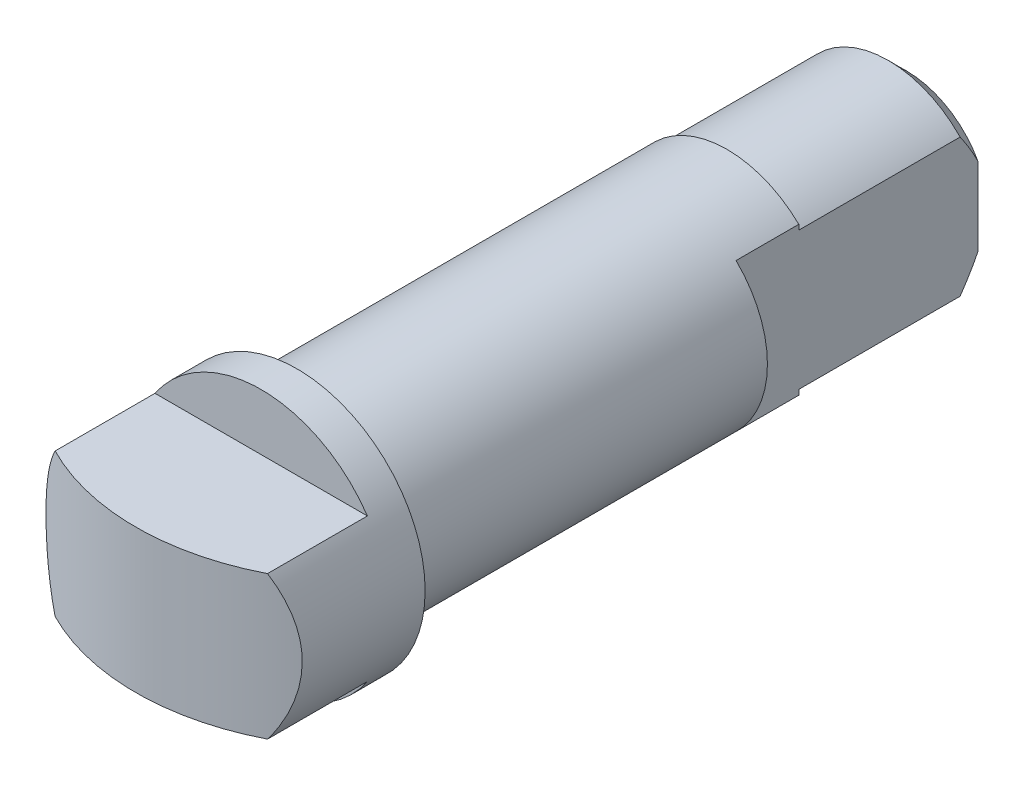
ISO-10303-21;
HEADER;
FILE_DESCRIPTION(('STEP AP214'),'2;1');
FILE_NAME('part.step','',(''),(''),'','','');
FILE_SCHEMA(('AUTOMOTIVE_DESIGN { 1 0 10303 214 1 1 1 1 }'));
ENDSEC;
DATA;
#1=APPLICATION_CONTEXT('core data for automotive mechanical design processes');
#2=APPLICATION_PROTOCOL_DEFINITION('international standard','automotive_design',2000,#1);
#3=PRODUCT_CONTEXT('',#1,'mechanical');
#4=PRODUCT('Part','Part','',(#3));
#5=PRODUCT_RELATED_PRODUCT_CATEGORY('part','',(#4));
#6=PRODUCT_DEFINITION_FORMATION('','',#4);
#7=PRODUCT_DEFINITION_CONTEXT('part definition',#1,'design');
#8=PRODUCT_DEFINITION('design','',#6,#7);
#9=PRODUCT_DEFINITION_SHAPE('','',#8);
#10=(LENGTH_UNIT() NAMED_UNIT(*) SI_UNIT(.MILLI.,.METRE.));
#11=(NAMED_UNIT(*) PLANE_ANGLE_UNIT() SI_UNIT($,.RADIAN.));
#12=(NAMED_UNIT(*) SI_UNIT($,.STERADIAN.) SOLID_ANGLE_UNIT());
#13=UNCERTAINTY_MEASURE_WITH_UNIT(LENGTH_MEASURE(1.E-05),#10,'distance_accuracy_value','');
#14=(GEOMETRIC_REPRESENTATION_CONTEXT(3) GLOBAL_UNCERTAINTY_ASSIGNED_CONTEXT((#13)) GLOBAL_UNIT_ASSIGNED_CONTEXT((#10,
#11,#12)) REPRESENTATION_CONTEXT('',''));
#15=CARTESIAN_POINT('',(0.,0.,0.));
#16=DIRECTION('',(0.,0.,1.));
#17=DIRECTION('',(1.,0.,0.));
#18=AXIS2_PLACEMENT_3D('',#15,#16,#17);
#19=CARTESIAN_POINT('',(0.,0.,2.));
#20=DIRECTION('',(0.,0.,1.));
#21=DIRECTION('',(1.,0.,0.));
#22=AXIS2_PLACEMENT_3D('',#19,#20,#21);
#23=PLANE('',#22);
#24=DIRECTION('',(1.,0.,0.));
#25=VECTOR('',#24,1.);
#26=CARTESIAN_POINT('',(-5.92642387954152,-4.,2.));
#27=LINE('',#26,#25);
#28=CARTESIAN_POINT('',(5.92642387954152,-4.,2.));
#29=VERTEX_POINT('',#28);
#30=CARTESIAN_POINT('',(-5.92642387954152,-4.,2.));
#31=VERTEX_POINT('',#30);
#32=EDGE_CURVE('E127',#29,#31,#27,.F.);
#33=ORIENTED_EDGE('',*,*,#32,.T.);
#34=CARTESIAN_POINT('',(0.,0.,2.));
#35=DIRECTION('',(0.,0.,1.));
#36=DIRECTION('',(1.,0.,0.));
#37=AXIS2_PLACEMENT_3D('',#34,#35,#36);
#38=CIRCLE('',#37,7.15);
#39=EDGE_CURVE('E142',#29,#31,#38,.F.);
#40=ORIENTED_EDGE('',*,*,#39,.F.);
#41=EDGE_LOOP('',(#33,#40));
#42=FACE_BOUND('',#41,.T.);
#43=ADVANCED_FACE('F18',(#42),#23,.T.);
#44=CARTESIAN_POINT('',(-5.92642387954152,-4.,9.));
#45=DIRECTION('',(0.,1.,0.));
#46=DIRECTION('',(0.,0.,1.));
#47=AXIS2_PLACEMENT_3D('',#44,#45,#46);
#48=PLANE('',#47);
#49=CARTESIAN_POINT('',(0.,-4.,-4.));
#50=DIRECTION('',(0.,-1.,0.));
#51=DIRECTION('',(1.,0.,0.));
#52=AXIS2_PLACEMENT_3D('',#49,#50,#51);
#53=CIRCLE('',#52,13.);
#54=CARTESIAN_POINT('',(-5.92642387954152,-4.,7.57054449885571));
#55=VERTEX_POINT('',#54);
#56=CARTESIAN_POINT('',(5.92642387954152,-4.,7.57054449885571));
#57=VERTEX_POINT('',#56);
#58=EDGE_CURVE('E21',#55,#57,#53,.F.);
#59=ORIENTED_EDGE('',*,*,#58,.F.);
#60=DIRECTION('',(0.,0.,1.));
#61=VECTOR('',#60,1.);
#62=CARTESIAN_POINT('',(-5.92642387954152,-4.,2.));
#63=LINE('',#62,#61);
#64=EDGE_CURVE('E120',#31,#55,#63,.T.);
#65=ORIENTED_EDGE('',*,*,#64,.F.);
#66=ORIENTED_EDGE('',*,*,#32,.F.);
#67=DIRECTION('',(0.,0.,1.));
#68=VECTOR('',#67,1.);
#69=CARTESIAN_POINT('',(5.92642387954152,-4.,2.));
#70=LINE('',#69,#68);
#71=EDGE_CURVE('E123',#57,#29,#70,.F.);
#72=ORIENTED_EDGE('',*,*,#71,.F.);
#73=EDGE_LOOP('',(#59,#65,#66,#72));
#74=FACE_BOUND('',#73,.T.);
#75=ADVANCED_FACE('F118',(#74),#48,.F.);
#76=CARTESIAN_POINT('',(0.,-7.150025,-4.));
#77=DIRECTION('',(0.,-1.,0.));
#78=DIRECTION('',(1.,0.,0.));
#79=AXIS2_PLACEMENT_3D('',#76,#77,#78);
#80=CYLINDRICAL_SURFACE('',#79,13.);
#81=ORIENTED_EDGE('',*,*,#58,.T.);
#82=CARTESIAN_POINT('',(5.92642387954152,4.,7.5705444988557));
#83=CARTESIAN_POINT('',(6.02826761777369,3.84910914606283,7.5183814585744));
#84=CARTESIAN_POINT('',(6.12455282690973,3.69402246735806,7.46736474262982));
#85=CARTESIAN_POINT('',(6.30546458594265,3.375961064015,7.36889298785948));
#86=CARTESIAN_POINT('',(6.39008275677941,3.21298078267545,7.32144051983297));
#87=CARTESIAN_POINT('',(6.54744381171085,2.87885042349019,7.23117366676062));
#88=CARTESIAN_POINT('',(6.62011213854141,2.70765706924609,7.18838892325316));
#89=CARTESIAN_POINT('',(6.7522657595311,2.35885152674343,7.10913357046209));
#90=CARTESIAN_POINT('',(6.81175298508131,2.18124028332255,7.07266203629257));
#91=CARTESIAN_POINT('',(6.91715186286272,1.81965618390198,7.00712899211632));
#92=CARTESIAN_POINT('',(6.96299207258808,1.63565529208902,6.97810658391696));
#93=CARTESIAN_POINT('',(7.0400531629363,1.26343493269416,6.92884948345827));
#94=CARTESIAN_POINT('',(7.07127343097694,1.0752152886908,6.90861515942624));
#95=CARTESIAN_POINT('',(7.11850768977287,0.696820913701711,6.87785109189797));
#96=CARTESIAN_POINT('',(7.13457960639309,0.50665646432597,6.86728438493025));
#97=CARTESIAN_POINT('',(7.15144656078072,0.125369130713346,6.85619269347045));
#98=CARTESIAN_POINT('',(7.152243284267,-0.0657536454373228,6.85566660093001));
#99=CARTESIAN_POINT('',(7.13921273877081,-0.428836660185208,6.86423874187427));
#100=CARTESIAN_POINT('',(7.12678511067466,-0.600871374204956,6.87241586145475));
#101=CARTESIAN_POINT('',(7.08961929954047,-0.943099367338352,6.89668714401131));
#102=CARTESIAN_POINT('',(7.06487666612975,-1.11329195801475,6.91278416904327));
#103=CARTESIAN_POINT('',(7.00331887607993,-1.4510548080192,6.95239074843211));
#104=CARTESIAN_POINT('',(6.96647314683044,-1.61861728874921,6.97591906850672));
#105=CARTESIAN_POINT('',(6.88116734128126,-1.94969505064608,7.02959962368301));
#106=CARTESIAN_POINT('',(6.83270232069214,-2.11320857611657,7.05975467816371));
#107=CARTESIAN_POINT('',(6.6748369075381,-2.58366949860598,7.156226468105));
#108=CARTESIAN_POINT('',(6.5503952455409,-2.88418668691921,7.23028975247378));
#109=CARTESIAN_POINT('',(6.33615682639975,-3.31684461145012,7.35164226832429));
#110=CARTESIAN_POINT('',(6.26036675517842,-3.45772172242448,7.39368746993782));
#111=CARTESIAN_POINT('',(6.09994470177552,-3.73343261915048,7.48037427437496));
#112=CARTESIAN_POINT('',(6.01531661223371,-3.86826902840262,7.52501473032939));
#113=CARTESIAN_POINT('',(5.92642387954152,-4.,7.57054449885571));
#114=B_SPLINE_CURVE_WITH_KNOTS('',3,(#82,#83,#84,#85,#86,#87,#88,#89,#90,#91,#92,#93,#94,#95,
#96,#97,#98,#99,#100,#101,#102,#103,#104,#105,#106,#107,#108,#109,#110,#111,#112,#113),
.UNSPECIFIED.,.F.,.F.,(4,2,2,2,2,2,2,2,2,2,2,2,2,2,2,4),(0.,0.568038351333795,1.13648255612546,
1.7083488585824,2.28013131152445,2.85485645138771,3.42960567034178,4.00214807803391,
4.57462730151,5.09202666368455,5.60961313853929,6.12851723045966,6.64764252175597,
7.64433512535002,8.14026186855841,8.63597109841601),.UNSPECIFIED.);
#115=CARTESIAN_POINT('',(5.92642387954152,4.,7.57054449885571));
#116=VERTEX_POINT('',#115);
#117=EDGE_CURVE('E149',#116,#57,#114,.T.);
#118=ORIENTED_EDGE('',*,*,#117,.F.);
#119=CARTESIAN_POINT('',(0.,4.,-4.));
#120=DIRECTION('',(0.,-1.,0.));
#121=DIRECTION('',(1.,0.,0.));
#122=AXIS2_PLACEMENT_3D('',#119,#120,#121);
#123=CIRCLE('',#122,13.);
#124=CARTESIAN_POINT('',(-5.92642387954152,4.,7.57054449885571));
#125=VERTEX_POINT('',#124);
#126=EDGE_CURVE('E132',#116,#125,#123,.T.);
#127=ORIENTED_EDGE('',*,*,#126,.T.);
#128=CARTESIAN_POINT('',(-5.92642387954152,-4.,7.57054449885571));
#129=CARTESIAN_POINT('',(-6.02826761777369,-3.84910914606283,7.51838145857441));
#130=CARTESIAN_POINT('',(-6.12455282690973,-3.69402246735806,7.46736474262982));
#131=CARTESIAN_POINT('',(-6.30546458594265,-3.375961064015,7.36889298785949));
#132=CARTESIAN_POINT('',(-6.39008275677941,-3.21298078267545,7.32144051983297));
#133=CARTESIAN_POINT('',(-6.54744381171085,-2.87885042349019,7.23117366676062));
#134=CARTESIAN_POINT('',(-6.62011213854141,-2.70765706924609,7.18838892325317));
#135=CARTESIAN_POINT('',(-6.7522657595311,-2.35885152674343,7.10913357046209));
#136=CARTESIAN_POINT('',(-6.81175298508131,-2.18124028332255,7.07266203629257));
#137=CARTESIAN_POINT('',(-6.91715186286272,-1.81965618390198,7.00712899211632));
#138=CARTESIAN_POINT('',(-6.96299207258808,-1.63565529208902,6.97810658391696));
#139=CARTESIAN_POINT('',(-7.0400531629363,-1.26343493269416,6.92884948345827));
#140=CARTESIAN_POINT('',(-7.07127343097694,-1.07521528869081,6.90861515942625));
#141=CARTESIAN_POINT('',(-7.11850768977287,-0.696820913701711,6.87785109189797));
#142=CARTESIAN_POINT('',(-7.13457960639309,-0.50665646432597,6.86728438493025));
#143=CARTESIAN_POINT('',(-7.15144656078072,-0.125369130713347,6.85619269347045));
#144=CARTESIAN_POINT('',(-7.152243284267,0.0657536454373224,6.85566660093001));
#145=CARTESIAN_POINT('',(-7.13921273877081,0.428836660185208,6.86423874187427));
#146=CARTESIAN_POINT('',(-7.12678511067466,0.600871374204956,6.87241586145475));
#147=CARTESIAN_POINT('',(-7.08961929954047,0.943099367338351,6.89668714401132));
#148=CARTESIAN_POINT('',(-7.06487666612975,1.11329195801475,6.91278416904327));
#149=CARTESIAN_POINT('',(-7.00331887607993,1.4510548080192,6.95239074843212));
#150=CARTESIAN_POINT('',(-6.96647314683044,1.61861728874921,6.97591906850672));
#151=CARTESIAN_POINT('',(-6.88116734128126,1.94969505064608,7.02959962368301));
#152=CARTESIAN_POINT('',(-6.83270232069214,2.11320857611657,7.05975467816371));
#153=CARTESIAN_POINT('',(-6.6748369075381,2.58366949860598,7.156226468105));
#154=CARTESIAN_POINT('',(-6.5503952455409,2.88418668691921,7.23028975247378));
#155=CARTESIAN_POINT('',(-6.33615682639975,3.31684461145012,7.35164226832429));
#156=CARTESIAN_POINT('',(-6.26036675517842,3.45772172242448,7.39368746993782));
#157=CARTESIAN_POINT('',(-6.09994470177552,3.73343261915048,7.48037427437496));
#158=CARTESIAN_POINT('',(-6.01531661223371,3.86826902840262,7.52501473032939));
#159=CARTESIAN_POINT('',(-5.92642387954152,4.,7.57054449885571));
#160=B_SPLINE_CURVE_WITH_KNOTS('',3,(#128,#129,#130,#131,#132,#133,#134,#135,#136,#137,#138,
#139,#140,#141,#142,#143,#144,#145,#146,#147,#148,#149,#150,#151,#152,#153,#154,#155,#156,#157,
#158,#159),.UNSPECIFIED.,.F.,.F.,(4,2,2,2,2,2,2,2,2,2,2,2,2,2,2,4),(0.,0.568038351333795,
1.13648255612546,1.7083488585824,2.28013131152445,2.85485645138771,3.42960567034178,
4.00214807803391,4.57462730151,5.09202666368455,5.60961313853929,6.12851723045966,
6.64764252175597,7.64433512535002,8.1402618685584,8.63597109841601),.UNSPECIFIED.);
#161=EDGE_CURVE('E129',#55,#125,#160,.T.);
#162=ORIENTED_EDGE('',*,*,#161,.F.);
#163=EDGE_LOOP('',(#81,#118,#127,#162));
#164=FACE_BOUND('',#163,.T.);
#165=ADVANCED_FACE('F130',(#164),#80,.T.);
#166=CARTESIAN_POINT('',(0.,0.,2.));
#167=DIRECTION('',(0.,0.,1.));
#168=DIRECTION('',(1.,0.,0.));
#169=AXIS2_PLACEMENT_3D('',#166,#167,#168);
#170=PLANE('',#169);
#171=DIRECTION('',(1.,0.,0.));
#172=VECTOR('',#171,1.);
#173=CARTESIAN_POINT('',(-5.92642387954152,4.,2.));
#174=LINE('',#173,#172);
#175=CARTESIAN_POINT('',(-5.92642387954152,4.,2.));
#176=VERTEX_POINT('',#175);
#177=CARTESIAN_POINT('',(5.92642387954152,4.,2.));
#178=VERTEX_POINT('',#177);
#179=EDGE_CURVE('E126',#176,#178,#174,.T.);
#180=ORIENTED_EDGE('',*,*,#179,.T.);
#181=CARTESIAN_POINT('',(0.,0.,2.));
#182=DIRECTION('',(0.,0.,1.));
#183=DIRECTION('',(1.,0.,0.));
#184=AXIS2_PLACEMENT_3D('',#181,#182,#183);
#185=CIRCLE('',#184,7.15);
#186=EDGE_CURVE('E292',#176,#178,#185,.F.);
#187=ORIENTED_EDGE('',*,*,#186,.F.);
#188=EDGE_LOOP('',(#180,#187));
#189=FACE_BOUND('',#188,.T.);
#190=ADVANCED_FACE('F310',(#189),#170,.T.);
#191=CARTESIAN_POINT('',(-5.92642387954152,4.,9.));
#192=DIRECTION('',(0.,-1.,0.));
#193=DIRECTION('',(1.,0.,0.));
#194=AXIS2_PLACEMENT_3D('',#191,#192,#193);
#195=PLANE('',#194);
#196=ORIENTED_EDGE('',*,*,#126,.F.);
#197=DIRECTION('',(0.,0.,1.));
#198=VECTOR('',#197,1.);
#199=CARTESIAN_POINT('',(5.92642387954152,4.,2.));
#200=LINE('',#199,#198);
#201=EDGE_CURVE('E290',#178,#116,#200,.T.);
#202=ORIENTED_EDGE('',*,*,#201,.F.);
#203=ORIENTED_EDGE('',*,*,#179,.F.);
#204=DIRECTION('',(0.,0.,1.));
#205=VECTOR('',#204,1.);
#206=CARTESIAN_POINT('',(-5.92642387954152,4.,2.));
#207=LINE('',#206,#205);
#208=EDGE_CURVE('E136',#125,#176,#207,.F.);
#209=ORIENTED_EDGE('',*,*,#208,.F.);
#210=EDGE_LOOP('',(#196,#202,#203,#209));
#211=FACE_BOUND('',#210,.T.);
#212=ADVANCED_FACE('F316',(#211),#195,.F.);
#213=CARTESIAN_POINT('',(0.,0.,2.));
#214=DIRECTION('',(0.,0.,1.));
#215=DIRECTION('',(1.,0.,0.));
#216=AXIS2_PLACEMENT_3D('',#213,#214,#215);
#217=CYLINDRICAL_SURFACE('',#216,7.15);
#218=ORIENTED_EDGE('',*,*,#186,.T.);
#219=ORIENTED_EDGE('',*,*,#201,.T.);
#220=ORIENTED_EDGE('',*,*,#117,.T.);
#221=ORIENTED_EDGE('',*,*,#71,.T.);
#222=ORIENTED_EDGE('',*,*,#39,.T.);
#223=ORIENTED_EDGE('',*,*,#64,.T.);
#224=ORIENTED_EDGE('',*,*,#161,.T.);
#225=ORIENTED_EDGE('',*,*,#208,.T.);
#226=EDGE_LOOP('',(#218,#219,#220,#221,#222,#223,#224,#225));
#227=FACE_BOUND('',#226,.T.);
#228=CARTESIAN_POINT('',(0.,0.,0.));
#229=DIRECTION('',(0.,0.,1.));
#230=DIRECTION('',(1.,0.,0.));
#231=AXIS2_PLACEMENT_3D('',#228,#229,#230);
#232=CIRCLE('',#231,7.15);
#233=CARTESIAN_POINT('',(7.15,0.,0.));
#234=VERTEX_POINT('',#233);
#235=EDGE_CURVE('E285',#234,#234,#232,.T.);
#236=ORIENTED_EDGE('',*,*,#235,.T.);
#237=EDGE_LOOP('',(#236));
#238=FACE_BOUND('',#237,.T.);
#239=ADVANCED_FACE('F139',(#227,#238),#217,.T.);
#240=CARTESIAN_POINT('',(0.,0.,-38.6095659183702));
#241=DIRECTION('',(0.,0.,1.));
#242=DIRECTION('',(1.,0.,0.));
#243=AXIS2_PLACEMENT_3D('',#240,#241,#242);
#244=CYLINDRICAL_SURFACE('',#243,5.55);
#245=DIRECTION('',(0.,0.,1.));
#246=VECTOR('',#245,1.);
#247=CARTESIAN_POINT('',(4.,-3.84740172064213,-20.5));
#248=LINE('',#247,#246);
#249=CARTESIAN_POINT('',(4.,-3.84740172064987,-32.9999999999528));
#250=VERTEX_POINT('',#249);
#251=CARTESIAN_POINT('',(4.,-3.84740172064213,-24.));
#252=VERTEX_POINT('',#251);
#253=EDGE_CURVE('E269',#250,#252,#248,.T.);
#254=ORIENTED_EDGE('',*,*,#253,.T.);
#255=CARTESIAN_POINT('',(0.,0.,-24.));
#256=DIRECTION('',(0.,0.,1.));
#257=DIRECTION('',(1.,0.,0.));
#258=AXIS2_PLACEMENT_3D('',#255,#256,#257);
#259=CIRCLE('',#258,5.55);
#260=CARTESIAN_POINT('',(-4.,-3.84740172064212,-24.));
#261=VERTEX_POINT('',#260);
#262=EDGE_CURVE('E339',#261,#252,#259,.T.);
#263=ORIENTED_EDGE('',*,*,#262,.F.);
#264=DIRECTION('',(0.,0.,1.));
#265=VECTOR('',#264,1.);
#266=CARTESIAN_POINT('',(-4.,-3.84740172064212,-20.5));
#267=LINE('',#266,#265);
#268=CARTESIAN_POINT('',(-4.,-3.84740172066226,-32.9999999999442));
#269=VERTEX_POINT('',#268);
#270=EDGE_CURVE('E261',#261,#269,#267,.F.);
#271=ORIENTED_EDGE('',*,*,#270,.T.);
#272=CARTESIAN_POINT('',(0.,0.,-32.9999999999586));
#273=DIRECTION('',(0.,0.,1.));
#274=DIRECTION('',(1.,0.,0.));
#275=AXIS2_PLACEMENT_3D('',#272,#273,#274);
#276=CIRCLE('',#275,5.55000000002792);
#277=EDGE_CURVE('E287',#250,#269,#276,.F.);
#278=ORIENTED_EDGE('',*,*,#277,.F.);
#279=EDGE_LOOP('',(#254,#263,#271,#278));
#280=FACE_BOUND('',#279,.T.);
#281=ADVANCED_FACE('F325',(#280),#244,.T.);
#282=CARTESIAN_POINT('',(0.,0.,-33.0000000000155));
#283=DIRECTION('',(0.,0.,1.));
#284=DIRECTION('',(1.,0.,0.));
#285=AXIS2_PLACEMENT_3D('',#282,#283,#284);
#286=CONICAL_SURFACE('',#285,5.54999999991423,0.785398163397448);
#287=CARTESIAN_POINT('',(-4.,-3.84740172061732,-32.9999999999469));
#288=CARTESIAN_POINT('',(-4.,-3.71334624797155,-33.0928721347658));
#289=CARTESIAN_POINT('',(-4.,-3.57813526733865,-33.1841357244921));
#290=CARTESIAN_POINT('',(-4.,-3.30513111755587,-33.3622224096445));
#291=CARTESIAN_POINT('',(-4.,-3.16734235631569,-33.4490522801269));
#292=CARTESIAN_POINT('',(-4.,-2.88842399877376,-33.6173887213157));
#293=CARTESIAN_POINT('',(-4.,-2.74729281132558,-33.6988926843124));
#294=CARTESIAN_POINT('',(-4.,-2.53264670941345,-33.8160057737275));
#295=CARTESIAN_POINT('',(-4.,-2.4605479938757,-33.8542146368809));
#296=CARTESIAN_POINT('',(-4.,-2.31532196283319,-33.9286541604015));
#297=CARTESIAN_POINT('',(-4.,-2.24219447123362,-33.9648844767912));
#298=CARTESIAN_POINT('',(-4.,-2.16852484419748,-33.9999999999405));
#299=B_SPLINE_CURVE_WITH_KNOTS('',3,(#287,#288,#289,#290,#291,#292,#293,#294,#295,#296,#297,
#298),.UNSPECIFIED.,.F.,.F.,(4,2,2,2,2,4),(0.,0.489285920590118,0.977800312369852,
1.46655212911046,1.71131730395998,1.9561248975318),.UNSPECIFIED.);
#300=CARTESIAN_POINT('',(-4.,-2.16852484420328,-33.9999999999377));
#301=VERTEX_POINT('',#300);
#302=EDGE_CURVE('E178',#269,#301,#299,.T.);
#303=ORIENTED_EDGE('',*,*,#302,.T.);
#304=CARTESIAN_POINT('',(0.,0.,-33.999999999935));
#305=DIRECTION('',(0.,0.,1.));
#306=DIRECTION('',(1.,0.,0.));
#307=AXIS2_PLACEMENT_3D('',#304,#305,#306);
#308=CIRCLE('',#307,4.54999999999472);
#309=CARTESIAN_POINT('',(4.,-2.16852484414086,-33.9999999999675));
#310=VERTEX_POINT('',#309);
#311=EDGE_CURVE('E289',#310,#301,#308,.F.);
#312=ORIENTED_EDGE('',*,*,#311,.F.);
#313=CARTESIAN_POINT('',(4.,-2.16852484419749,-33.9999999999405));
#314=CARTESIAN_POINT('',(4.,-2.24219447123362,-33.9648844767912));
#315=CARTESIAN_POINT('',(4.,-2.31532196283319,-33.9286541604015));
#316=CARTESIAN_POINT('',(4.,-2.4605479938757,-33.8542146368809));
#317=CARTESIAN_POINT('',(4.,-2.53264670941345,-33.8160057737275));
#318=CARTESIAN_POINT('',(4.,-2.74729281132559,-33.6988926843124));
#319=CARTESIAN_POINT('',(4.,-2.88842399877376,-33.6173887213156));
#320=CARTESIAN_POINT('',(4.,-3.1673423563157,-33.4490522801269));
#321=CARTESIAN_POINT('',(4.,-3.30513111755588,-33.3622224096445));
#322=CARTESIAN_POINT('',(4.,-3.57813526733865,-33.1841357244921));
#323=CARTESIAN_POINT('',(4.,-3.71334624797156,-33.0928721347658));
#324=CARTESIAN_POINT('',(4.,-3.84740172061732,-32.9999999999469));
#325=B_SPLINE_CURVE_WITH_KNOTS('',3,(#313,#314,#315,#316,#317,#318,#319,#320,#321,#322,#323,
#324),.UNSPECIFIED.,.F.,.F.,(4,2,2,2,2,4),(0.,0.244807593571818,0.489572768421334,
0.978324585161955,1.46683897694169,1.9561248975318),.UNSPECIFIED.);
#326=EDGE_CURVE('E209',#310,#250,#325,.T.);
#327=ORIENTED_EDGE('',*,*,#326,.T.);
#328=ORIENTED_EDGE('',*,*,#277,.T.);
#329=EDGE_LOOP('',(#303,#312,#327,#328));
#330=FACE_BOUND('',#329,.T.);
#331=ADVANCED_FACE('F329',(#330),#286,.T.);
#332=CARTESIAN_POINT('',(0.,0.,-34.));
#333=DIRECTION('',(0.,0.,-1.));
#334=DIRECTION('',(-1.,0.,0.));
#335=AXIS2_PLACEMENT_3D('',#332,#333,#334);
#336=PLANE('',#335);
#337=DIRECTION('',(0.,-1.,0.));
#338=VECTOR('',#337,1.);
#339=CARTESIAN_POINT('',(4.,9.6,-34.));
#340=LINE('',#339,#338);
#341=CARTESIAN_POINT('',(4.,2.16852484420328,-33.9999999999377));
#342=VERTEX_POINT('',#341);
#343=EDGE_CURVE('E206',#342,#310,#340,.T.);
#344=ORIENTED_EDGE('',*,*,#343,.T.);
#345=ORIENTED_EDGE('',*,*,#311,.T.);
#346=DIRECTION('',(0.,1.,0.));
#347=VECTOR('',#346,1.);
#348=CARTESIAN_POINT('',(-4.,9.6,-34.));
#349=LINE('',#348,#347);
#350=CARTESIAN_POINT('',(-4.,2.16852484414085,-33.9999999999675));
#351=VERTEX_POINT('',#350);
#352=EDGE_CURVE('E177',#301,#351,#349,.T.);
#353=ORIENTED_EDGE('',*,*,#352,.T.);
#354=CARTESIAN_POINT('',(0.,0.,-33.999999999935));
#355=DIRECTION('',(0.,0.,1.));
#356=DIRECTION('',(1.,0.,0.));
#357=AXIS2_PLACEMENT_3D('',#354,#355,#356);
#358=CIRCLE('',#357,4.54999999999472);
#359=EDGE_CURVE('E286',#342,#351,#358,.T.);
#360=ORIENTED_EDGE('',*,*,#359,.F.);
#361=EDGE_LOOP('',(#344,#345,#353,#360));
#362=FACE_BOUND('',#361,.T.);
#363=ADVANCED_FACE('F194',(#362),#336,.T.);
#364=CARTESIAN_POINT('',(0.,0.,-33.0000000000155));
#365=DIRECTION('',(0.,0.,1.));
#366=DIRECTION('',(1.,0.,0.));
#367=AXIS2_PLACEMENT_3D('',#364,#365,#366);
#368=CONICAL_SURFACE('',#367,5.54999999991423,0.785398163397448);
#369=CARTESIAN_POINT('',(4.,3.84740172060921,-32.9999999999525));
#370=CARTESIAN_POINT('',(4.,3.71334624796408,-33.0928721347709));
#371=CARTESIAN_POINT('',(4.,3.57813526733181,-33.1841357244966));
#372=CARTESIAN_POINT('',(4.,3.30513111755032,-33.3622224096481));
#373=CARTESIAN_POINT('',(4.,3.1673423563108,-33.4490522801299));
#374=CARTESIAN_POINT('',(4.,2.8884239987702,-33.6173887213177));
#375=CARTESIAN_POINT('',(4.,2.74729281132271,-33.698892684314));
#376=CARTESIAN_POINT('',(4.,2.53264670941163,-33.8160057737285));
#377=CARTESIAN_POINT('',(4.,2.46054799387424,-33.8542146368817));
#378=CARTESIAN_POINT('',(4.,2.31532196283245,-33.9286541604019));
#379=CARTESIAN_POINT('',(4.,2.24219447123325,-33.9648844767914));
#380=CARTESIAN_POINT('',(4.,2.16852484419749,-33.9999999999405));
#381=B_SPLINE_CURVE_WITH_KNOTS('',3,(#369,#370,#371,#372,#373,#374,#375,#376,#377,#378,#379,
#380),.UNSPECIFIED.,.F.,.F.,(4,2,2,2,2,4),(0.,0.489285920587646,0.977800312364913,
1.46655212910307,1.71131730395135,1.95612489752193),.UNSPECIFIED.);
#382=CARTESIAN_POINT('',(4.,3.84740172064213,-32.9999999999648));
#383=VERTEX_POINT('',#382);
#384=EDGE_CURVE('E199',#383,#342,#381,.T.);
#385=ORIENTED_EDGE('',*,*,#384,.T.);
#386=ORIENTED_EDGE('',*,*,#359,.T.);
#387=CARTESIAN_POINT('',(-4.,2.16852484419749,-33.9999999999405));
#388=CARTESIAN_POINT('',(-4.,2.24219447123325,-33.9648844767914));
#389=CARTESIAN_POINT('',(-4.,2.31532196283245,-33.9286541604019));
#390=CARTESIAN_POINT('',(-4.,2.46054799387424,-33.8542146368817));
#391=CARTESIAN_POINT('',(-4.,2.53264670941163,-33.8160057737285));
#392=CARTESIAN_POINT('',(-4.,2.74729281132271,-33.698892684314));
#393=CARTESIAN_POINT('',(-4.,2.8884239987702,-33.6173887213177));
#394=CARTESIAN_POINT('',(-4.,3.1673423563108,-33.4490522801299));
#395=CARTESIAN_POINT('',(-4.,3.30513111755032,-33.3622224096481));
#396=CARTESIAN_POINT('',(-4.,3.5781352673318,-33.1841357244966));
#397=CARTESIAN_POINT('',(-4.,3.71334624796407,-33.0928721347709));
#398=CARTESIAN_POINT('',(-4.,3.84740172060921,-32.9999999999525));
#399=B_SPLINE_CURVE_WITH_KNOTS('',3,(#387,#388,#389,#390,#391,#392,#393,#394,#395,#396,#397,
#398),.UNSPECIFIED.,.F.,.F.,(4,2,2,2,2,4),(0.,0.244807593570581,0.489572768418863,
0.978324585157017,1.46683897693428,1.95612489752193),.UNSPECIFIED.);
#400=CARTESIAN_POINT('',(-4.,3.84740172062567,-32.9999999999763));
#401=VERTEX_POINT('',#400);
#402=EDGE_CURVE('E170',#351,#401,#399,.T.);
#403=ORIENTED_EDGE('',*,*,#402,.T.);
#404=CARTESIAN_POINT('',(0.,0.,-33.));
#405=DIRECTION('',(0.,0.,1.));
#406=DIRECTION('',(1.,0.,0.));
#407=AXIS2_PLACEMENT_3D('',#404,#405,#406);
#408=CIRCLE('',#407,5.55);
#409=EDGE_CURVE('E282',#383,#401,#408,.T.);
#410=ORIENTED_EDGE('',*,*,#409,.F.);
#411=EDGE_LOOP('',(#385,#386,#403,#410));
#412=FACE_BOUND('',#411,.T.);
#413=ADVANCED_FACE('F188',(#412),#368,.T.);
#414=CARTESIAN_POINT('',(0.,0.,-38.6095659183702));
#415=DIRECTION('',(0.,0.,1.));
#416=DIRECTION('',(1.,0.,0.));
#417=AXIS2_PLACEMENT_3D('',#414,#415,#416);
#418=CYLINDRICAL_SURFACE('',#417,5.55);
#419=DIRECTION('',(0.,0.,1.));
#420=VECTOR('',#419,1.);
#421=CARTESIAN_POINT('',(-4.,3.84740172064213,-20.5));
#422=LINE('',#421,#420);
#423=CARTESIAN_POINT('',(-4.,3.84740172064213,-24.));
#424=VERTEX_POINT('',#423);
#425=EDGE_CURVE('E169',#401,#424,#422,.T.);
#426=ORIENTED_EDGE('',*,*,#425,.T.);
#427=CARTESIAN_POINT('',(0.,0.,-24.));
#428=DIRECTION('',(0.,0.,1.));
#429=DIRECTION('',(1.,0.,0.));
#430=AXIS2_PLACEMENT_3D('',#427,#428,#429);
#431=CIRCLE('',#430,5.55);
#432=CARTESIAN_POINT('',(4.,3.84740172064213,-24.));
#433=VERTEX_POINT('',#432);
#434=EDGE_CURVE('E208',#433,#424,#431,.T.);
#435=ORIENTED_EDGE('',*,*,#434,.F.);
#436=DIRECTION('',(0.,0.,1.));
#437=VECTOR('',#436,1.);
#438=CARTESIAN_POINT('',(4.,3.84740172064213,-20.5));
#439=LINE('',#438,#437);
#440=EDGE_CURVE('E207',#433,#383,#439,.F.);
#441=ORIENTED_EDGE('',*,*,#440,.T.);
#442=ORIENTED_EDGE('',*,*,#409,.T.);
#443=EDGE_LOOP('',(#426,#435,#441,#442));
#444=FACE_BOUND('',#443,.T.);
#445=ADVANCED_FACE('F193',(#444),#418,.T.);
#446=CARTESIAN_POINT('',(0.,0.,0.));
#447=DIRECTION('',(0.,0.,1.));
#448=DIRECTION('',(1.,0.,0.));
#449=AXIS2_PLACEMENT_3D('',#446,#447,#448);
#450=PLANE('',#449);
#451=CARTESIAN_POINT('',(0.,0.,0.));
#452=DIRECTION('',(0.,0.,-1.));
#453=DIRECTION('',(-1.,0.,0.));
#454=AXIS2_PLACEMENT_3D('',#451,#452,#453);
#455=CIRCLE('',#454,5.75);
#456=CARTESIAN_POINT('',(-5.75,0.,0.));
#457=VERTEX_POINT('',#456);
#458=EDGE_CURVE('E166',#457,#457,#455,.T.);
#459=ORIENTED_EDGE('',*,*,#458,.F.);
#460=EDGE_LOOP('',(#459));
#461=FACE_BOUND('',#460,.T.);
#462=ORIENTED_EDGE('',*,*,#235,.F.);
#463=EDGE_LOOP('',(#462));
#464=FACE_BOUND('',#463,.T.);
#465=ADVANCED_FACE('F231',(#461,#464),#450,.F.);
#466=CARTESIAN_POINT('',(-4.,-7.4,-20.5));
#467=DIRECTION('',(0.,0.,-1.));
#468=DIRECTION('',(-1.,0.,0.));
#469=AXIS2_PLACEMENT_3D('',#466,#467,#468);
#470=PLANE('',#469);
#471=DIRECTION('',(0.,1.,0.));
#472=VECTOR('',#471,1.);
#473=CARTESIAN_POINT('',(-4.,9.6,-20.5));
#474=LINE('',#473,#472);
#475=CARTESIAN_POINT('',(-4.,4.13067791046458,-20.5));
#476=VERTEX_POINT('',#475);
#477=CARTESIAN_POINT('',(-4.,-4.13067791046458,-20.5));
#478=VERTEX_POINT('',#477);
#479=EDGE_CURVE('E264',#476,#478,#474,.F.);
#480=ORIENTED_EDGE('',*,*,#479,.T.);
#481=CARTESIAN_POINT('',(0.,0.,-20.5));
#482=DIRECTION('',(0.,0.,-1.));
#483=DIRECTION('',(-1.,0.,0.));
#484=AXIS2_PLACEMENT_3D('',#481,#482,#483);
#485=CIRCLE('',#484,5.75);
#486=EDGE_CURVE('E163',#476,#478,#485,.F.);
#487=ORIENTED_EDGE('',*,*,#486,.F.);
#488=EDGE_LOOP('',(#480,#487));
#489=FACE_BOUND('',#488,.T.);
#490=ADVANCED_FACE('F228',(#489),#470,.T.);
#491=CARTESIAN_POINT('',(0.,0.,-24.));
#492=DIRECTION('',(0.,0.,-1.));
#493=DIRECTION('',(-1.,0.,0.));
#494=AXIS2_PLACEMENT_3D('',#491,#492,#493);
#495=PLANE('',#494);
#496=DIRECTION('',(0.,1.,0.));
#497=VECTOR('',#496,1.);
#498=CARTESIAN_POINT('',(-4.,9.6,-24.));
#499=LINE('',#498,#497);
#500=CARTESIAN_POINT('',(-4.,-4.13067791046458,-24.));
#501=VERTEX_POINT('',#500);
#502=EDGE_CURVE('E278',#501,#261,#499,.T.);
#503=ORIENTED_EDGE('',*,*,#502,.T.);
#504=ORIENTED_EDGE('',*,*,#262,.T.);
#505=DIRECTION('',(0.,-1.,0.));
#506=VECTOR('',#505,1.);
#507=CARTESIAN_POINT('',(4.,9.6,-24.));
#508=LINE('',#507,#506);
#509=CARTESIAN_POINT('',(4.,-4.13067791046458,-24.));
#510=VERTEX_POINT('',#509);
#511=EDGE_CURVE('E271',#252,#510,#508,.T.);
#512=ORIENTED_EDGE('',*,*,#511,.T.);
#513=CARTESIAN_POINT('',(0.,0.,-24.));
#514=DIRECTION('',(0.,0.,-1.));
#515=DIRECTION('',(-1.,0.,0.));
#516=AXIS2_PLACEMENT_3D('',#513,#514,#515);
#517=CIRCLE('',#516,5.75);
#518=EDGE_CURVE('E159',#501,#510,#517,.F.);
#519=ORIENTED_EDGE('',*,*,#518,.F.);
#520=EDGE_LOOP('',(#503,#504,#512,#519));
#521=FACE_BOUND('',#520,.T.);
#522=ADVANCED_FACE('F224',(#521),#495,.T.);
#523=CARTESIAN_POINT('',(14.4,-7.4,-20.5));
#524=DIRECTION('',(0.,0.,-1.));
#525=DIRECTION('',(-1.,0.,0.));
#526=AXIS2_PLACEMENT_3D('',#523,#524,#525);
#527=PLANE('',#526);
#528=CARTESIAN_POINT('',(0.,0.,-20.5));
#529=DIRECTION('',(0.,0.,-1.));
#530=DIRECTION('',(-1.,0.,0.));
#531=AXIS2_PLACEMENT_3D('',#528,#529,#530);
#532=CIRCLE('',#531,5.75);
#533=CARTESIAN_POINT('',(4.,-4.13067791046458,-20.5));
#534=VERTEX_POINT('',#533);
#535=CARTESIAN_POINT('',(4.,4.13067791046458,-20.5));
#536=VERTEX_POINT('',#535);
#537=EDGE_CURVE('E155',#534,#536,#532,.F.);
#538=ORIENTED_EDGE('',*,*,#537,.F.);
#539=DIRECTION('',(0.,-1.,0.));
#540=VECTOR('',#539,1.);
#541=CARTESIAN_POINT('',(4.,9.6,-20.5));
#542=LINE('',#541,#540);
#543=EDGE_CURVE('E268',#534,#536,#542,.F.);
#544=ORIENTED_EDGE('',*,*,#543,.T.);
#545=EDGE_LOOP('',(#538,#544));
#546=FACE_BOUND('',#545,.T.);
#547=ADVANCED_FACE('F219',(#546),#527,.T.);
#548=CARTESIAN_POINT('',(4.,9.6,-20.5));
#549=DIRECTION('',(-1.,0.,0.));
#550=DIRECTION('',(0.,-1.,0.));
#551=AXIS2_PLACEMENT_3D('',#548,#549,#550);
#552=PLANE('',#551);
#553=ORIENTED_EDGE('',*,*,#384,.F.);
#554=ORIENTED_EDGE('',*,*,#440,.F.);
#555=DIRECTION('',(0.,1.,0.));
#556=VECTOR('',#555,1.);
#557=CARTESIAN_POINT('',(4.,0.,-24.));
#558=LINE('',#557,#556);
#559=CARTESIAN_POINT('',(4.,4.13067791046458,-24.));
#560=VERTEX_POINT('',#559);
#561=EDGE_CURVE('E253',#560,#433,#558,.F.);
#562=ORIENTED_EDGE('',*,*,#561,.F.);
#563=DIRECTION('',(0.,0.,-1.));
#564=VECTOR('',#563,1.);
#565=CARTESIAN_POINT('',(4.,4.13067791046458,-24.));
#566=LINE('',#565,#564);
#567=EDGE_CURVE('E154',#536,#560,#566,.T.);
#568=ORIENTED_EDGE('',*,*,#567,.F.);
#569=ORIENTED_EDGE('',*,*,#543,.F.);
#570=DIRECTION('',(0.,0.,-1.));
#571=VECTOR('',#570,1.);
#572=CARTESIAN_POINT('',(4.,-4.13067791046458,-24.));
#573=LINE('',#572,#571);
#574=EDGE_CURVE('E158',#510,#534,#573,.F.);
#575=ORIENTED_EDGE('',*,*,#574,.F.);
#576=ORIENTED_EDGE('',*,*,#511,.F.);
#577=ORIENTED_EDGE('',*,*,#253,.F.);
#578=ORIENTED_EDGE('',*,*,#326,.F.);
#579=ORIENTED_EDGE('',*,*,#343,.F.);
#580=EDGE_LOOP('',(#553,#554,#562,#568,#569,#575,#576,#577,#578,#579));
#581=FACE_BOUND('',#580,.T.);
#582=ADVANCED_FACE('F214',(#581),#552,.F.);
#583=CARTESIAN_POINT('',(0.,0.,-24.));
#584=DIRECTION('',(0.,0.,-1.));
#585=DIRECTION('',(-1.,0.,0.));
#586=AXIS2_PLACEMENT_3D('',#583,#584,#585);
#587=PLANE('',#586);
#588=DIRECTION('',(0.,1.,0.));
#589=VECTOR('',#588,1.);
#590=CARTESIAN_POINT('',(-4.,9.6,-24.));
#591=LINE('',#590,#589);
#592=CARTESIAN_POINT('',(-4.,4.13067791046458,-24.));
#593=VERTEX_POINT('',#592);
#594=EDGE_CURVE('E36',#424,#593,#591,.T.);
#595=ORIENTED_EDGE('',*,*,#594,.T.);
#596=CARTESIAN_POINT('',(0.,0.,-24.));
#597=DIRECTION('',(0.,0.,-1.));
#598=DIRECTION('',(-1.,0.,0.));
#599=AXIS2_PLACEMENT_3D('',#596,#597,#598);
#600=CIRCLE('',#599,5.75);
#601=EDGE_CURVE('E27',#560,#593,#600,.F.);
#602=ORIENTED_EDGE('',*,*,#601,.F.);
#603=ORIENTED_EDGE('',*,*,#561,.T.);
#604=ORIENTED_EDGE('',*,*,#434,.T.);
#605=EDGE_LOOP('',(#595,#602,#603,#604));
#606=FACE_BOUND('',#605,.T.);
#607=ADVANCED_FACE('F218',(#606),#587,.T.);
#608=CARTESIAN_POINT('',(-4.,9.6,-20.5));
#609=DIRECTION('',(1.,0.,0.));
#610=DIRECTION('',(0.,1.,0.));
#611=AXIS2_PLACEMENT_3D('',#608,#609,#610);
#612=PLANE('',#611);
#613=ORIENTED_EDGE('',*,*,#402,.F.);
#614=ORIENTED_EDGE('',*,*,#352,.F.);
#615=ORIENTED_EDGE('',*,*,#302,.F.);
#616=ORIENTED_EDGE('',*,*,#270,.F.);
#617=ORIENTED_EDGE('',*,*,#502,.F.);
#618=DIRECTION('',(0.,0.,-1.));
#619=VECTOR('',#618,1.);
#620=CARTESIAN_POINT('',(-4.,-4.13067791046458,-24.));
#621=LINE('',#620,#619);
#622=EDGE_CURVE('E162',#478,#501,#621,.T.);
#623=ORIENTED_EDGE('',*,*,#622,.F.);
#624=ORIENTED_EDGE('',*,*,#479,.F.);
#625=DIRECTION('',(0.,0.,-1.));
#626=VECTOR('',#625,1.);
#627=CARTESIAN_POINT('',(-4.,4.13067791046458,-24.));
#628=LINE('',#627,#626);
#629=EDGE_CURVE('E11',#593,#476,#628,.F.);
#630=ORIENTED_EDGE('',*,*,#629,.F.);
#631=ORIENTED_EDGE('',*,*,#594,.F.);
#632=ORIENTED_EDGE('',*,*,#425,.F.);
#633=EDGE_LOOP('',(#613,#614,#615,#616,#617,#623,#624,#630,#631,#632));
#634=FACE_BOUND('',#633,.T.);
#635=ADVANCED_FACE('F184',(#634),#612,.F.);
#636=CARTESIAN_POINT('',(0.,0.,-24.));
#637=DIRECTION('',(0.,0.,-1.));
#638=DIRECTION('',(-1.,0.,0.));
#639=AXIS2_PLACEMENT_3D('',#636,#637,#638);
#640=CYLINDRICAL_SURFACE('',#639,5.75);
#641=ORIENTED_EDGE('',*,*,#601,.T.);
#642=ORIENTED_EDGE('',*,*,#629,.T.);
#643=ORIENTED_EDGE('',*,*,#486,.T.);
#644=ORIENTED_EDGE('',*,*,#622,.T.);
#645=ORIENTED_EDGE('',*,*,#518,.T.);
#646=ORIENTED_EDGE('',*,*,#574,.T.);
#647=ORIENTED_EDGE('',*,*,#537,.T.);
#648=ORIENTED_EDGE('',*,*,#567,.T.);
#649=EDGE_LOOP('',(#641,#642,#643,#644,#645,#646,#647,#648));
#650=FACE_BOUND('',#649,.T.);
#651=ORIENTED_EDGE('',*,*,#458,.T.);
#652=EDGE_LOOP('',(#651));
#653=FACE_BOUND('',#652,.T.);
#654=ADVANCED_FACE('F242',(#650,#653),#640,.T.);
#655=CLOSED_SHELL('',(#43,#75,#165,#190,#212,#239,#281,#331,#363,#413,#445,#465,#490,#522,#547,
#582,#607,#635,#654));
#656=MANIFOLD_SOLID_BREP('B1',#655);
#657=ADVANCED_BREP_SHAPE_REPRESENTATION('',(#18,#656),#14);
#658=SHAPE_DEFINITION_REPRESENTATION(#9,#657);
ENDSEC;
END-ISO-10303-21;
